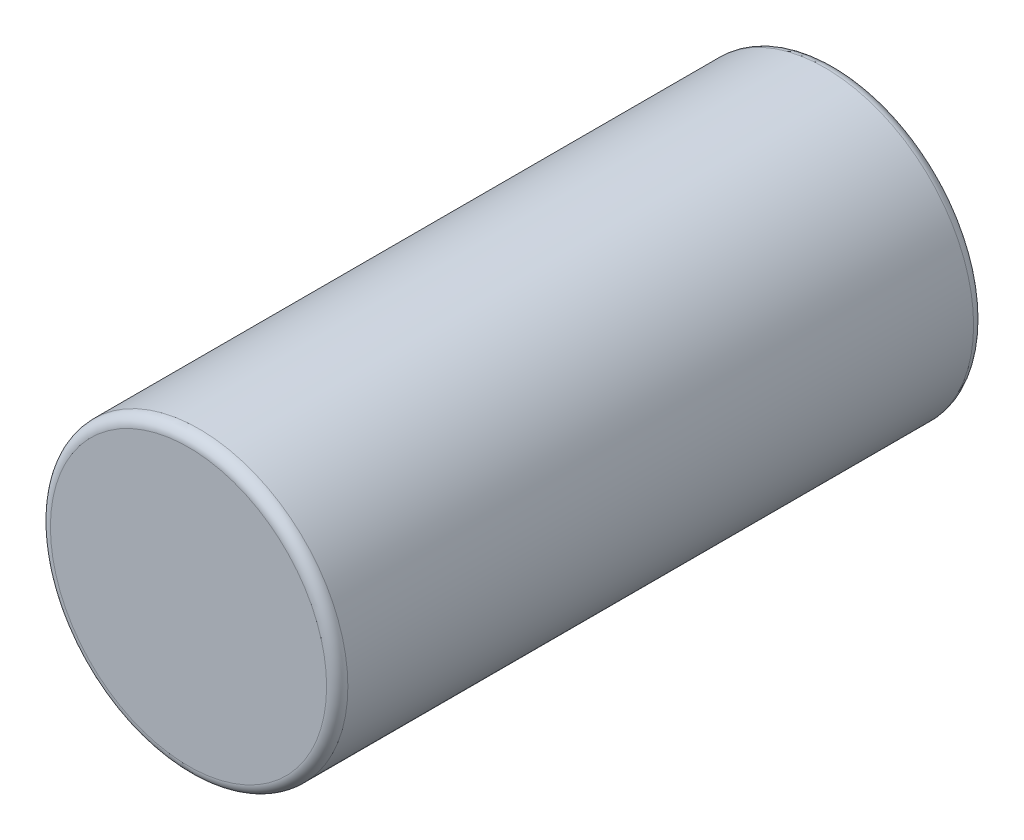
ISO-10303-21;
HEADER;
FILE_DESCRIPTION(('STEP AP214'),'2;1');
FILE_NAME('part.step','',(''),(''),'','','');
FILE_SCHEMA(('AUTOMOTIVE_DESIGN { 1 0 10303 214 1 1 1 1 }'));
ENDSEC;
DATA;
#1=APPLICATION_CONTEXT('core data for automotive mechanical design processes');
#2=APPLICATION_PROTOCOL_DEFINITION('international standard','automotive_design',2000,#1);
#3=PRODUCT_CONTEXT('',#1,'mechanical');
#4=PRODUCT('Part','Part','',(#3));
#5=PRODUCT_RELATED_PRODUCT_CATEGORY('part','',(#4));
#6=PRODUCT_DEFINITION_FORMATION('','',#4);
#7=PRODUCT_DEFINITION_CONTEXT('part definition',#1,'design');
#8=PRODUCT_DEFINITION('design','',#6,#7);
#9=PRODUCT_DEFINITION_SHAPE('','',#8);
#10=(LENGTH_UNIT() NAMED_UNIT(*) SI_UNIT(.MILLI.,.METRE.));
#11=(NAMED_UNIT(*) PLANE_ANGLE_UNIT() SI_UNIT($,.RADIAN.));
#12=(NAMED_UNIT(*) SI_UNIT($,.STERADIAN.) SOLID_ANGLE_UNIT());
#13=UNCERTAINTY_MEASURE_WITH_UNIT(LENGTH_MEASURE(1.E-05),#10,'distance_accuracy_value','');
#14=(GEOMETRIC_REPRESENTATION_CONTEXT(3) GLOBAL_UNCERTAINTY_ASSIGNED_CONTEXT((#13)) GLOBAL_UNIT_ASSIGNED_CONTEXT((#10,
#11,#12)) REPRESENTATION_CONTEXT('',''));
#15=CARTESIAN_POINT('',(0.,0.,0.));
#16=DIRECTION('',(0.,0.,1.));
#17=DIRECTION('',(1.,0.,0.));
#18=AXIS2_PLACEMENT_3D('',#15,#16,#17);
#19=CARTESIAN_POINT('',(0.,0.,0.));
#20=DIRECTION('',(0.,0.,-1.));
#21=DIRECTION('',(-1.,0.,0.));
#22=AXIS2_PLACEMENT_3D('',#19,#20,#21);
#23=PLANE('',#22);
#24=CARTESIAN_POINT('',(0.,0.,0.));
#25=DIRECTION('',(0.,0.,1.));
#26=DIRECTION('',(1.,0.,0.));
#27=AXIS2_PLACEMENT_3D('',#24,#25,#26);
#28=CIRCLE('',#27,6.5);
#29=CARTESIAN_POINT('',(6.5,0.,0.));
#30=VERTEX_POINT('',#29);
#31=EDGE_CURVE('E10',#30,#30,#28,.T.);
#32=ORIENTED_EDGE('',*,*,#31,.T.);
#33=EDGE_LOOP('',(#32));
#34=FACE_BOUND('',#33,.T.);
#35=ADVANCED_FACE('F39',(#34),#23,.F.);
#36=CARTESIAN_POINT('',(0.,0.,-0.5));
#37=DIRECTION('',(0.,0.,1.));
#38=DIRECTION('',(1.,0.,0.));
#39=AXIS2_PLACEMENT_3D('',#36,#37,#38);
#40=TOROIDAL_SURFACE('',#39,6.5,0.5);
#41=ORIENTED_EDGE('',*,*,#31,.F.);
#42=EDGE_LOOP('',(#41));
#43=FACE_BOUND('',#42,.T.);
#44=CARTESIAN_POINT('',(0.,0.,-0.500000000000004));
#45=DIRECTION('',(0.,0.,1.));
#46=DIRECTION('',(1.,0.,0.));
#47=AXIS2_PLACEMENT_3D('',#44,#45,#46);
#48=CIRCLE('',#47,7.);
#49=CARTESIAN_POINT('',(7.,0.,-0.500000000000004));
#50=VERTEX_POINT('',#49);
#51=EDGE_CURVE('E45',#50,#50,#48,.T.);
#52=ORIENTED_EDGE('',*,*,#51,.T.);
#53=EDGE_LOOP('',(#52));
#54=FACE_BOUND('',#53,.T.);
#55=ADVANCED_FACE('F71',(#43,#54),#40,.T.);
#56=CARTESIAN_POINT('',(0.,0.,0.));
#57=DIRECTION('',(0.,0.,1.));
#58=DIRECTION('',(1.,0.,0.));
#59=AXIS2_PLACEMENT_3D('',#56,#57,#58);
#60=CYLINDRICAL_SURFACE('',#59,7.);
#61=ORIENTED_EDGE('',*,*,#51,.F.);
#62=EDGE_LOOP('',(#61));
#63=FACE_BOUND('',#62,.T.);
#64=CARTESIAN_POINT('',(0.,0.,-29.95));
#65=DIRECTION('',(0.,0.,1.));
#66=DIRECTION('',(1.,0.,0.));
#67=AXIS2_PLACEMENT_3D('',#64,#65,#66);
#68=CIRCLE('',#67,7.);
#69=CARTESIAN_POINT('',(7.,0.,-29.95));
#70=VERTEX_POINT('',#69);
#71=EDGE_CURVE('E49',#70,#70,#68,.T.);
#72=ORIENTED_EDGE('',*,*,#71,.T.);
#73=EDGE_LOOP('',(#72));
#74=FACE_BOUND('',#73,.T.);
#75=ADVANCED_FACE('F67',(#63,#74),#60,.T.);
#76=CARTESIAN_POINT('',(0.,0.,-29.95));
#77=DIRECTION('',(0.,0.,1.));
#78=DIRECTION('',(1.,0.,0.));
#79=AXIS2_PLACEMENT_3D('',#76,#77,#78);
#80=TOROIDAL_SURFACE('',#79,6.5,0.5);
#81=ORIENTED_EDGE('',*,*,#71,.F.);
#82=EDGE_LOOP('',(#81));
#83=FACE_BOUND('',#82,.T.);
#84=CARTESIAN_POINT('',(0.,0.,-30.45));
#85=DIRECTION('',(0.,0.,1.));
#86=DIRECTION('',(1.,0.,0.));
#87=AXIS2_PLACEMENT_3D('',#84,#85,#86);
#88=CIRCLE('',#87,6.5);
#89=CARTESIAN_POINT('',(6.5,0.,-30.45));
#90=VERTEX_POINT('',#89);
#91=EDGE_CURVE('E53',#90,#90,#88,.T.);
#92=ORIENTED_EDGE('',*,*,#91,.T.);
#93=EDGE_LOOP('',(#92));
#94=FACE_BOUND('',#93,.T.);
#95=ADVANCED_FACE('F59',(#83,#94),#80,.T.);
#96=CARTESIAN_POINT('',(0.,6.5,-30.45));
#97=DIRECTION('',(0.,0.,1.));
#98=DIRECTION('',(1.,0.,0.));
#99=AXIS2_PLACEMENT_3D('',#96,#97,#98);
#100=PLANE('',#99);
#101=ORIENTED_EDGE('',*,*,#91,.F.);
#102=EDGE_LOOP('',(#101));
#103=FACE_BOUND('',#102,.T.);
#104=ADVANCED_FACE('F61',(#103),#100,.F.);
#105=CLOSED_SHELL('',(#35,#55,#75,#95,#104));
#106=MANIFOLD_SOLID_BREP('B2',#105);
#107=ADVANCED_BREP_SHAPE_REPRESENTATION('',(#18,#106),#14);
#108=SHAPE_DEFINITION_REPRESENTATION(#9,#107);
ENDSEC;
END-ISO-10303-21;
